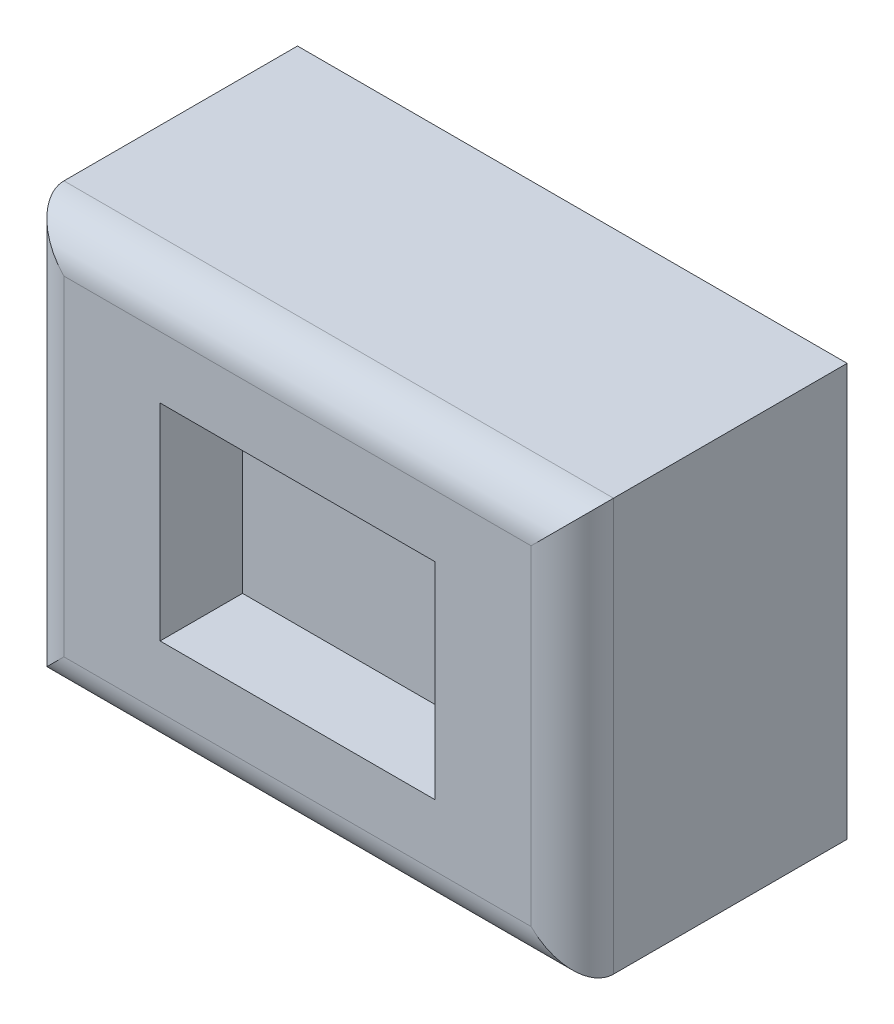
ISO-10303-21;
HEADER;
FILE_DESCRIPTION(('STEP AP214'),'2;1');
FILE_NAME('part.step','',(''),(''),'','','');
FILE_SCHEMA(('AUTOMOTIVE_DESIGN { 1 0 10303 214 1 1 1 1 }'));
ENDSEC;
DATA;
#1=APPLICATION_CONTEXT('core data for automotive mechanical design processes');
#2=APPLICATION_PROTOCOL_DEFINITION('international standard','automotive_design',2000,#1);
#3=PRODUCT_CONTEXT('',#1,'mechanical');
#4=PRODUCT('Part','Part','',(#3));
#5=PRODUCT_RELATED_PRODUCT_CATEGORY('part','',(#4));
#6=PRODUCT_DEFINITION_FORMATION('','',#4);
#7=PRODUCT_DEFINITION_CONTEXT('part definition',#1,'design');
#8=PRODUCT_DEFINITION('design','',#6,#7);
#9=PRODUCT_DEFINITION_SHAPE('','',#8);
#10=(LENGTH_UNIT() NAMED_UNIT(*) SI_UNIT(.MILLI.,.METRE.));
#11=(NAMED_UNIT(*) PLANE_ANGLE_UNIT() SI_UNIT($,.RADIAN.));
#12=(NAMED_UNIT(*) SI_UNIT($,.STERADIAN.) SOLID_ANGLE_UNIT());
#13=UNCERTAINTY_MEASURE_WITH_UNIT(LENGTH_MEASURE(1.E-05),#10,'distance_accuracy_value','');
#14=(GEOMETRIC_REPRESENTATION_CONTEXT(3) GLOBAL_UNCERTAINTY_ASSIGNED_CONTEXT((#13)) GLOBAL_UNIT_ASSIGNED_CONTEXT((#10,
#11,#12)) REPRESENTATION_CONTEXT('',''));
#15=CARTESIAN_POINT('',(0.,0.,0.));
#16=DIRECTION('',(0.,0.,1.));
#17=DIRECTION('',(1.,0.,0.));
#18=AXIS2_PLACEMENT_3D('',#15,#16,#17);
#19=CARTESIAN_POINT('',(-20.,-15.,20.));
#20=DIRECTION('',(1.,0.,0.));
#21=DIRECTION('',(0.,0.,-1.));
#22=AXIS2_PLACEMENT_3D('',#19,#20,#21);
#23=PLANE('',#22);
#24=DIRECTION('',(0.,0.,-1.));
#25=VECTOR('',#24,1.);
#26=CARTESIAN_POINT('',(-20.,-15.,20.));
#27=LINE('',#26,#25);
#28=CARTESIAN_POINT('',(-20.,-15.,17.));
#29=VERTEX_POINT('',#28);
#30=CARTESIAN_POINT('',(-20.,-15.,0.));
#31=VERTEX_POINT('',#30);
#32=EDGE_CURVE('E180',#29,#31,#27,.T.);
#33=ORIENTED_EDGE('',*,*,#32,.F.);
#34=DIRECTION('',(0.,-1.,0.));
#35=VECTOR('',#34,1.);
#36=CARTESIAN_POINT('',(-20.,-15.,17.));
#37=LINE('',#36,#35);
#38=CARTESIAN_POINT('',(-20.,15.,17.));
#39=VERTEX_POINT('',#38);
#40=EDGE_CURVE('E186',#29,#39,#37,.F.);
#41=ORIENTED_EDGE('',*,*,#40,.T.);
#42=DIRECTION('',(0.,0.,-1.));
#43=VECTOR('',#42,1.);
#44=CARTESIAN_POINT('',(-20.,15.,20.));
#45=LINE('',#44,#43);
#46=CARTESIAN_POINT('',(-20.,15.,0.));
#47=VERTEX_POINT('',#46);
#48=EDGE_CURVE('E175',#39,#47,#45,.T.);
#49=ORIENTED_EDGE('',*,*,#48,.T.);
#50=DIRECTION('',(0.,-1.,0.));
#51=VECTOR('',#50,1.);
#52=CARTESIAN_POINT('',(-20.,-15.,0.));
#53=LINE('',#52,#51);
#54=EDGE_CURVE('E160',#47,#31,#53,.T.);
#55=ORIENTED_EDGE('',*,*,#54,.T.);
#56=EDGE_LOOP('',(#33,#41,#49,#55));
#57=FACE_BOUND('',#56,.T.);
#58=ADVANCED_FACE('F41',(#57),#23,.F.);
#59=CARTESIAN_POINT('',(-20.,-15.,20.));
#60=DIRECTION('',(0.,1.,0.));
#61=DIRECTION('',(0.,0.,1.));
#62=AXIS2_PLACEMENT_3D('',#59,#60,#61);
#63=PLANE('',#62);
#64=DIRECTION('',(0.,0.,-1.));
#65=VECTOR('',#64,1.);
#66=CARTESIAN_POINT('',(20.,-15.,20.));
#67=LINE('',#66,#65);
#68=CARTESIAN_POINT('',(20.,-15.,17.));
#69=VERTEX_POINT('',#68);
#70=CARTESIAN_POINT('',(20.,-15.,0.));
#71=VERTEX_POINT('',#70);
#72=EDGE_CURVE('E179',#69,#71,#67,.T.);
#73=ORIENTED_EDGE('',*,*,#72,.F.);
#74=DIRECTION('',(1.,0.,0.));
#75=VECTOR('',#74,1.);
#76=CARTESIAN_POINT('',(-20.,-15.,17.));
#77=LINE('',#76,#75);
#78=EDGE_CURVE('E191',#69,#29,#77,.F.);
#79=ORIENTED_EDGE('',*,*,#78,.T.);
#80=ORIENTED_EDGE('',*,*,#32,.T.);
#81=DIRECTION('',(1.,0.,0.));
#82=VECTOR('',#81,1.);
#83=CARTESIAN_POINT('',(-20.,-15.,0.));
#84=LINE('',#83,#82);
#85=EDGE_CURVE('E162',#31,#71,#84,.T.);
#86=ORIENTED_EDGE('',*,*,#85,.T.);
#87=EDGE_LOOP('',(#73,#79,#80,#86));
#88=FACE_BOUND('',#87,.T.);
#89=ADVANCED_FACE('F216',(#88),#63,.F.);
#90=CARTESIAN_POINT('',(20.,-15.,20.));
#91=DIRECTION('',(-1.,0.,0.));
#92=DIRECTION('',(0.,0.,1.));
#93=AXIS2_PLACEMENT_3D('',#90,#91,#92);
#94=PLANE('',#93);
#95=DIRECTION('',(0.,0.,-1.));
#96=VECTOR('',#95,1.);
#97=CARTESIAN_POINT('',(20.,15.,20.));
#98=LINE('',#97,#96);
#99=CARTESIAN_POINT('',(20.,15.,17.));
#100=VERTEX_POINT('',#99);
#101=CARTESIAN_POINT('',(20.,15.,0.));
#102=VERTEX_POINT('',#101);
#103=EDGE_CURVE('E171',#100,#102,#98,.T.);
#104=ORIENTED_EDGE('',*,*,#103,.F.);
#105=DIRECTION('',(0.,1.,0.));
#106=VECTOR('',#105,1.);
#107=CARTESIAN_POINT('',(20.,-15.,17.));
#108=LINE('',#107,#106);
#109=EDGE_CURVE('E49',#100,#69,#108,.F.);
#110=ORIENTED_EDGE('',*,*,#109,.T.);
#111=ORIENTED_EDGE('',*,*,#72,.T.);
#112=DIRECTION('',(0.,1.,0.));
#113=VECTOR('',#112,1.);
#114=CARTESIAN_POINT('',(20.,-15.,0.));
#115=LINE('',#114,#113);
#116=EDGE_CURVE('E167',#71,#102,#115,.T.);
#117=ORIENTED_EDGE('',*,*,#116,.T.);
#118=EDGE_LOOP('',(#104,#110,#111,#117));
#119=FACE_BOUND('',#118,.T.);
#120=ADVANCED_FACE('F252',(#119),#94,.F.);
#121=CARTESIAN_POINT('',(-20.,15.,20.));
#122=DIRECTION('',(0.,-1.,0.));
#123=DIRECTION('',(0.,0.,-1.));
#124=AXIS2_PLACEMENT_3D('',#121,#122,#123);
#125=PLANE('',#124);
#126=ORIENTED_EDGE('',*,*,#48,.F.);
#127=DIRECTION('',(-1.,0.,0.));
#128=VECTOR('',#127,1.);
#129=CARTESIAN_POINT('',(-20.,15.,17.));
#130=LINE('',#129,#128);
#131=EDGE_CURVE('E11',#39,#100,#130,.F.);
#132=ORIENTED_EDGE('',*,*,#131,.T.);
#133=ORIENTED_EDGE('',*,*,#103,.T.);
#134=DIRECTION('',(-1.,0.,0.));
#135=VECTOR('',#134,1.);
#136=CARTESIAN_POINT('',(-20.,15.,0.));
#137=LINE('',#136,#135);
#138=EDGE_CURVE('E166',#102,#47,#137,.T.);
#139=ORIENTED_EDGE('',*,*,#138,.T.);
#140=EDGE_LOOP('',(#126,#132,#133,#139));
#141=FACE_BOUND('',#140,.T.);
#142=ADVANCED_FACE('F226',(#141),#125,.F.);
#143=CARTESIAN_POINT('',(0.,0.,20.));
#144=DIRECTION('',(0.,0.,-1.));
#145=DIRECTION('',(-1.,0.,0.));
#146=AXIS2_PLACEMENT_3D('',#143,#144,#145);
#147=PLANE('',#146);
#148=DIRECTION('',(-1.,0.,0.));
#149=VECTOR('',#148,1.);
#150=CARTESIAN_POINT('',(0.,12.,20.));
#151=LINE('',#150,#149);
#152=CARTESIAN_POINT('',(17.,12.,20.));
#153=VERTEX_POINT('',#152);
#154=CARTESIAN_POINT('',(-17.,12.,20.));
#155=VERTEX_POINT('',#154);
#156=EDGE_CURVE('E177',#153,#155,#151,.T.);
#157=ORIENTED_EDGE('',*,*,#156,.T.);
#158=DIRECTION('',(0.,-1.,0.));
#159=VECTOR('',#158,1.);
#160=CARTESIAN_POINT('',(-17.,0.,20.));
#161=LINE('',#160,#159);
#162=CARTESIAN_POINT('',(-17.,-12.,20.));
#163=VERTEX_POINT('',#162);
#164=EDGE_CURVE('E187',#155,#163,#161,.T.);
#165=ORIENTED_EDGE('',*,*,#164,.T.);
#166=DIRECTION('',(1.,0.,0.));
#167=VECTOR('',#166,1.);
#168=CARTESIAN_POINT('',(0.,-12.,20.));
#169=LINE('',#168,#167);
#170=CARTESIAN_POINT('',(17.,-12.,20.));
#171=VERTEX_POINT('',#170);
#172=EDGE_CURVE('E184',#163,#171,#169,.T.);
#173=ORIENTED_EDGE('',*,*,#172,.T.);
#174=DIRECTION('',(0.,1.,0.));
#175=VECTOR('',#174,1.);
#176=CARTESIAN_POINT('',(17.,0.,20.));
#177=LINE('',#176,#175);
#178=EDGE_CURVE('E185',#171,#153,#177,.T.);
#179=ORIENTED_EDGE('',*,*,#178,.T.);
#180=EDGE_LOOP('',(#157,#165,#173,#179));
#181=FACE_BOUND('',#180,.T.);
#182=DIRECTION('',(1.,0.,0.));
#183=VECTOR('',#182,1.);
#184=CARTESIAN_POINT('',(-10.,-7.5,20.));
#185=LINE('',#184,#183);
#186=CARTESIAN_POINT('',(-10.,-7.5,20.));
#187=VERTEX_POINT('',#186);
#188=CARTESIAN_POINT('',(10.,-7.5,20.));
#189=VERTEX_POINT('',#188);
#190=EDGE_CURVE('E151',#187,#189,#185,.T.);
#191=ORIENTED_EDGE('',*,*,#190,.F.);
#192=DIRECTION('',(0.,-1.,0.));
#193=VECTOR('',#192,1.);
#194=CARTESIAN_POINT('',(-10.,-7.5,20.));
#195=LINE('',#194,#193);
#196=CARTESIAN_POINT('',(-10.,7.5,20.));
#197=VERTEX_POINT('',#196);
#198=EDGE_CURVE('E122',#197,#187,#195,.T.);
#199=ORIENTED_EDGE('',*,*,#198,.F.);
#200=DIRECTION('',(-1.,0.,0.));
#201=VECTOR('',#200,1.);
#202=CARTESIAN_POINT('',(-10.,7.5,20.));
#203=LINE('',#202,#201);
#204=CARTESIAN_POINT('',(10.,7.5,20.));
#205=VERTEX_POINT('',#204);
#206=EDGE_CURVE('E142',#205,#197,#203,.T.);
#207=ORIENTED_EDGE('',*,*,#206,.F.);
#208=DIRECTION('',(0.,1.,0.));
#209=VECTOR('',#208,1.);
#210=CARTESIAN_POINT('',(10.,-7.5,20.));
#211=LINE('',#210,#209);
#212=EDGE_CURVE('E144',#189,#205,#211,.T.);
#213=ORIENTED_EDGE('',*,*,#212,.F.);
#214=EDGE_LOOP('',(#191,#199,#207,#213));
#215=FACE_BOUND('',#214,.T.);
#216=ADVANCED_FACE('F223',(#181,#215),#147,.F.);
#217=CARTESIAN_POINT('',(0.,0.,0.));
#218=DIRECTION('',(0.,0.,-1.));
#219=DIRECTION('',(-1.,0.,0.));
#220=AXIS2_PLACEMENT_3D('',#217,#218,#219);
#221=PLANE('',#220);
#222=ORIENTED_EDGE('',*,*,#54,.F.);
#223=ORIENTED_EDGE('',*,*,#138,.F.);
#224=ORIENTED_EDGE('',*,*,#116,.F.);
#225=ORIENTED_EDGE('',*,*,#85,.F.);
#226=EDGE_LOOP('',(#222,#223,#224,#225));
#227=FACE_BOUND('',#226,.T.);
#228=ADVANCED_FACE('F229',(#227),#221,.T.);
#229=CARTESIAN_POINT('',(-10.,-7.5,14.));
#230=DIRECTION('',(-1.,0.,0.));
#231=DIRECTION('',(0.,0.,1.));
#232=AXIS2_PLACEMENT_3D('',#229,#230,#231);
#233=PLANE('',#232);
#234=ORIENTED_EDGE('',*,*,#198,.T.);
#235=DIRECTION('',(0.,0.,1.));
#236=VECTOR('',#235,1.);
#237=CARTESIAN_POINT('',(-10.,-7.5,14.));
#238=LINE('',#237,#236);
#239=CARTESIAN_POINT('',(-10.,-7.5,14.));
#240=VERTEX_POINT('',#239);
#241=EDGE_CURVE('E119',#240,#187,#238,.T.);
#242=ORIENTED_EDGE('',*,*,#241,.F.);
#243=DIRECTION('',(0.,-1.,0.));
#244=VECTOR('',#243,1.);
#245=CARTESIAN_POINT('',(-10.,-7.5,14.));
#246=LINE('',#245,#244);
#247=CARTESIAN_POINT('',(-10.,7.5,14.));
#248=VERTEX_POINT('',#247);
#249=EDGE_CURVE('E121',#248,#240,#246,.T.);
#250=ORIENTED_EDGE('',*,*,#249,.F.);
#251=DIRECTION('',(0.,0.,1.));
#252=VECTOR('',#251,1.);
#253=CARTESIAN_POINT('',(-10.,7.5,14.));
#254=LINE('',#253,#252);
#255=EDGE_CURVE('E154',#248,#197,#254,.T.);
#256=ORIENTED_EDGE('',*,*,#255,.T.);
#257=EDGE_LOOP('',(#234,#242,#250,#256));
#258=FACE_BOUND('',#257,.T.);
#259=ADVANCED_FACE('F118',(#258),#233,.F.);
#260=CARTESIAN_POINT('',(-10.,7.5,14.));
#261=DIRECTION('',(0.,1.,0.));
#262=DIRECTION('',(0.,0.,1.));
#263=AXIS2_PLACEMENT_3D('',#260,#261,#262);
#264=PLANE('',#263);
#265=ORIENTED_EDGE('',*,*,#206,.T.);
#266=ORIENTED_EDGE('',*,*,#255,.F.);
#267=DIRECTION('',(-1.,0.,0.));
#268=VECTOR('',#267,1.);
#269=CARTESIAN_POINT('',(-10.,7.5,14.));
#270=LINE('',#269,#268);
#271=CARTESIAN_POINT('',(10.,7.5,14.));
#272=VERTEX_POINT('',#271);
#273=EDGE_CURVE('E128',#272,#248,#270,.T.);
#274=ORIENTED_EDGE('',*,*,#273,.F.);
#275=DIRECTION('',(0.,0.,1.));
#276=VECTOR('',#275,1.);
#277=CARTESIAN_POINT('',(10.,7.5,14.));
#278=LINE('',#277,#276);
#279=EDGE_CURVE('E158',#272,#205,#278,.T.);
#280=ORIENTED_EDGE('',*,*,#279,.T.);
#281=EDGE_LOOP('',(#265,#266,#274,#280));
#282=FACE_BOUND('',#281,.T.);
#283=ADVANCED_FACE('F237',(#282),#264,.F.);
#284=CARTESIAN_POINT('',(10.,-7.5,14.));
#285=DIRECTION('',(1.,0.,0.));
#286=DIRECTION('',(0.,0.,-1.));
#287=AXIS2_PLACEMENT_3D('',#284,#285,#286);
#288=PLANE('',#287);
#289=ORIENTED_EDGE('',*,*,#212,.T.);
#290=ORIENTED_EDGE('',*,*,#279,.F.);
#291=DIRECTION('',(0.,1.,0.));
#292=VECTOR('',#291,1.);
#293=CARTESIAN_POINT('',(10.,-7.5,14.));
#294=LINE('',#293,#292);
#295=CARTESIAN_POINT('',(10.,-7.5,14.));
#296=VERTEX_POINT('',#295);
#297=EDGE_CURVE('E140',#296,#272,#294,.T.);
#298=ORIENTED_EDGE('',*,*,#297,.F.);
#299=DIRECTION('',(0.,0.,1.));
#300=VECTOR('',#299,1.);
#301=CARTESIAN_POINT('',(10.,-7.5,14.));
#302=LINE('',#301,#300);
#303=EDGE_CURVE('E129',#296,#189,#302,.T.);
#304=ORIENTED_EDGE('',*,*,#303,.T.);
#305=EDGE_LOOP('',(#289,#290,#298,#304));
#306=FACE_BOUND('',#305,.T.);
#307=ADVANCED_FACE('F233',(#306),#288,.F.);
#308=CARTESIAN_POINT('',(-10.,-7.5,14.));
#309=DIRECTION('',(0.,-1.,0.));
#310=DIRECTION('',(0.,0.,-1.));
#311=AXIS2_PLACEMENT_3D('',#308,#309,#310);
#312=PLANE('',#311);
#313=ORIENTED_EDGE('',*,*,#190,.T.);
#314=ORIENTED_EDGE('',*,*,#303,.F.);
#315=DIRECTION('',(1.,0.,0.));
#316=VECTOR('',#315,1.);
#317=CARTESIAN_POINT('',(-10.,-7.5,14.));
#318=LINE('',#317,#316);
#319=EDGE_CURVE('E134',#240,#296,#318,.T.);
#320=ORIENTED_EDGE('',*,*,#319,.F.);
#321=ORIENTED_EDGE('',*,*,#241,.T.);
#322=EDGE_LOOP('',(#313,#314,#320,#321));
#323=FACE_BOUND('',#322,.T.);
#324=ADVANCED_FACE('F131',(#323),#312,.F.);
#325=CARTESIAN_POINT('',(0.,0.,14.));
#326=DIRECTION('',(0.,0.,-1.));
#327=DIRECTION('',(-1.,0.,0.));
#328=AXIS2_PLACEMENT_3D('',#325,#326,#327);
#329=PLANE('',#328);
#330=ORIENTED_EDGE('',*,*,#249,.T.);
#331=ORIENTED_EDGE('',*,*,#319,.T.);
#332=ORIENTED_EDGE('',*,*,#297,.T.);
#333=ORIENTED_EDGE('',*,*,#273,.T.);
#334=EDGE_LOOP('',(#330,#331,#332,#333));
#335=FACE_BOUND('',#334,.T.);
#336=ADVANCED_FACE('F137',(#335),#329,.F.);
#337=CARTESIAN_POINT('',(17.,0.,17.));
#338=DIRECTION('',(0.,1.,0.));
#339=DIRECTION('',(0.,0.,1.));
#340=AXIS2_PLACEMENT_3D('',#337,#338,#339);
#341=CYLINDRICAL_SURFACE('',#340,3.);
#342=CARTESIAN_POINT('',(17.,-12.,17.));
#343=DIRECTION('',(0.707106781186547,0.707106781186547,0.));
#344=DIRECTION('',(-0.707106781186547,0.707106781186547,0.));
#345=AXIS2_PLACEMENT_3D('',#342,#343,#344);
#346=ELLIPSE('',#345,4.24264068711928,3.);
#347=EDGE_CURVE('E196',#69,#171,#346,.F.);
#348=ORIENTED_EDGE('',*,*,#347,.F.);
#349=ORIENTED_EDGE('',*,*,#109,.F.);
#350=CARTESIAN_POINT('',(17.,12.,17.));
#351=DIRECTION('',(-0.707106781186547,0.707106781186547,0.));
#352=DIRECTION('',(-0.707106781186547,-0.707106781186547,0.));
#353=AXIS2_PLACEMENT_3D('',#350,#351,#352);
#354=ELLIPSE('',#353,4.24264068711928,3.);
#355=EDGE_CURVE('E44',#153,#100,#354,.T.);
#356=ORIENTED_EDGE('',*,*,#355,.F.);
#357=ORIENTED_EDGE('',*,*,#178,.F.);
#358=EDGE_LOOP('',(#348,#349,#356,#357));
#359=FACE_BOUND('',#358,.T.);
#360=ADVANCED_FACE('F43',(#359),#341,.T.);
#361=CARTESIAN_POINT('',(0.,12.,17.));
#362=DIRECTION('',(-1.,0.,0.));
#363=DIRECTION('',(0.,0.,1.));
#364=AXIS2_PLACEMENT_3D('',#361,#362,#363);
#365=CYLINDRICAL_SURFACE('',#364,3.);
#366=ORIENTED_EDGE('',*,*,#355,.T.);
#367=ORIENTED_EDGE('',*,*,#131,.F.);
#368=CARTESIAN_POINT('',(-17.,12.,17.));
#369=DIRECTION('',(-0.707106781186547,-0.707106781186547,0.));
#370=DIRECTION('',(-0.707106781186547,0.707106781186547,0.));
#371=AXIS2_PLACEMENT_3D('',#368,#369,#370);
#372=ELLIPSE('',#371,4.24264068711928,3.);
#373=EDGE_CURVE('E197',#155,#39,#372,.T.);
#374=ORIENTED_EDGE('',*,*,#373,.F.);
#375=ORIENTED_EDGE('',*,*,#156,.F.);
#376=EDGE_LOOP('',(#366,#367,#374,#375));
#377=FACE_BOUND('',#376,.T.);
#378=ADVANCED_FACE('F208',(#377),#365,.T.);
#379=CARTESIAN_POINT('',(0.,-12.,17.));
#380=DIRECTION('',(1.,0.,0.));
#381=DIRECTION('',(0.,0.,-1.));
#382=AXIS2_PLACEMENT_3D('',#379,#380,#381);
#383=CYLINDRICAL_SURFACE('',#382,3.);
#384=ORIENTED_EDGE('',*,*,#347,.T.);
#385=ORIENTED_EDGE('',*,*,#172,.F.);
#386=CARTESIAN_POINT('',(-17.,-12.,17.));
#387=DIRECTION('',(0.707106781186547,-0.707106781186547,0.));
#388=DIRECTION('',(0.707106781186547,0.707106781186547,0.));
#389=AXIS2_PLACEMENT_3D('',#386,#387,#388);
#390=ELLIPSE('',#389,4.24264068711928,3.);
#391=EDGE_CURVE('E192',#29,#163,#390,.F.);
#392=ORIENTED_EDGE('',*,*,#391,.F.);
#393=ORIENTED_EDGE('',*,*,#78,.F.);
#394=EDGE_LOOP('',(#384,#385,#392,#393));
#395=FACE_BOUND('',#394,.T.);
#396=ADVANCED_FACE('F213',(#395),#383,.T.);
#397=CARTESIAN_POINT('',(-17.,0.,17.));
#398=DIRECTION('',(0.,-1.,0.));
#399=DIRECTION('',(0.,0.,-1.));
#400=AXIS2_PLACEMENT_3D('',#397,#398,#399);
#401=CYLINDRICAL_SURFACE('',#400,3.);
#402=ORIENTED_EDGE('',*,*,#373,.T.);
#403=ORIENTED_EDGE('',*,*,#40,.F.);
#404=ORIENTED_EDGE('',*,*,#391,.T.);
#405=ORIENTED_EDGE('',*,*,#164,.F.);
#406=EDGE_LOOP('',(#402,#403,#404,#405));
#407=FACE_BOUND('',#406,.T.);
#408=ADVANCED_FACE('F225',(#407),#401,.T.);
#409=CLOSED_SHELL('',(#58,#89,#120,#142,#216,#228,#259,#283,#307,#324,#336,#360,#378,#396,#408));
#410=MANIFOLD_SOLID_BREP('B2',#409);
#411=ADVANCED_BREP_SHAPE_REPRESENTATION('',(#18,#410),#14);
#412=SHAPE_DEFINITION_REPRESENTATION(#9,#411);
ENDSEC;
END-ISO-10303-21;
